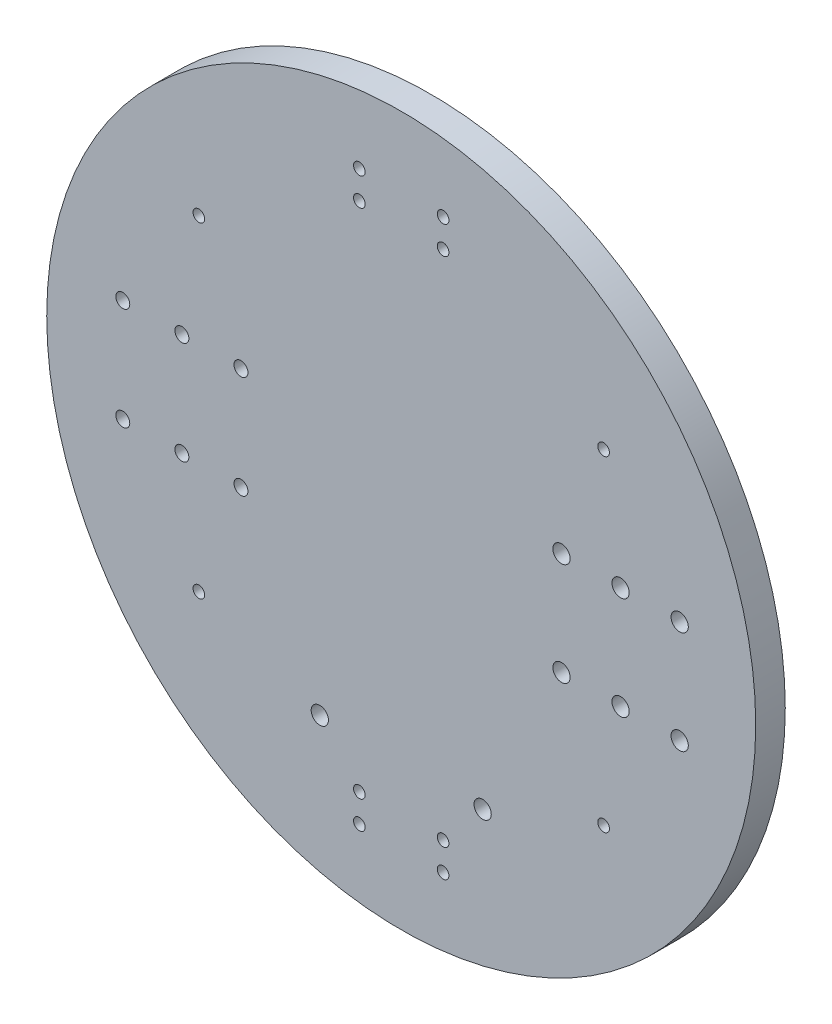
ISO-10303-21;
HEADER;
FILE_DESCRIPTION(('STEP AP214'),'2;1');
FILE_NAME('part.step','',(''),(''),'','','');
FILE_SCHEMA(('AUTOMOTIVE_DESIGN { 1 0 10303 214 1 1 1 1 }'));
ENDSEC;
DATA;
#1=APPLICATION_CONTEXT('core data for automotive mechanical design processes');
#2=APPLICATION_PROTOCOL_DEFINITION('international standard','automotive_design',2000,#1);
#3=PRODUCT_CONTEXT('',#1,'mechanical');
#4=PRODUCT('Part','Part','',(#3));
#5=PRODUCT_RELATED_PRODUCT_CATEGORY('part','',(#4));
#6=PRODUCT_DEFINITION_FORMATION('','',#4);
#7=PRODUCT_DEFINITION_CONTEXT('part definition',#1,'design');
#8=PRODUCT_DEFINITION('design','',#6,#7);
#9=PRODUCT_DEFINITION_SHAPE('','',#8);
#10=(LENGTH_UNIT() NAMED_UNIT(*) SI_UNIT(.MILLI.,.METRE.));
#11=(NAMED_UNIT(*) PLANE_ANGLE_UNIT() SI_UNIT($,.RADIAN.));
#12=(NAMED_UNIT(*) SI_UNIT($,.STERADIAN.) SOLID_ANGLE_UNIT());
#13=UNCERTAINTY_MEASURE_WITH_UNIT(LENGTH_MEASURE(1.E-05),#10,'distance_accuracy_value','');
#14=(GEOMETRIC_REPRESENTATION_CONTEXT(3) GLOBAL_UNCERTAINTY_ASSIGNED_CONTEXT((#13)) GLOBAL_UNIT_ASSIGNED_CONTEXT((#10,
#11,#12)) REPRESENTATION_CONTEXT('',''));
#15=CARTESIAN_POINT('',(0.,0.,0.));
#16=DIRECTION('',(0.,0.,1.));
#17=DIRECTION('',(1.,0.,0.));
#18=AXIS2_PLACEMENT_3D('',#15,#16,#17);
#19=CARTESIAN_POINT('',(0.,0.,6.35));
#20=DIRECTION('',(0.,0.,-1.));
#21=DIRECTION('',(-1.,0.,0.));
#22=AXIS2_PLACEMENT_3D('',#19,#20,#21);
#23=CYLINDRICAL_SURFACE('',#22,76.2);
#24=CARTESIAN_POINT('',(0.,0.,6.35));
#25=DIRECTION('',(0.,0.,1.));
#26=DIRECTION('',(1.,0.,0.));
#27=AXIS2_PLACEMENT_3D('',#24,#25,#26);
#28=CIRCLE('',#27,76.2);
#29=CARTESIAN_POINT('',(76.2,0.,6.35));
#30=VERTEX_POINT('',#29);
#31=EDGE_CURVE('E10',#30,#30,#28,.T.);
#32=ORIENTED_EDGE('',*,*,#31,.F.);
#33=EDGE_LOOP('',(#32));
#34=FACE_BOUND('',#33,.T.);
#35=CARTESIAN_POINT('',(0.,0.,0.));
#36=DIRECTION('',(0.,0.,1.));
#37=DIRECTION('',(1.,0.,0.));
#38=AXIS2_PLACEMENT_3D('',#35,#36,#37);
#39=CIRCLE('',#38,76.2);
#40=CARTESIAN_POINT('',(76.2,0.,0.));
#41=VERTEX_POINT('',#40);
#42=EDGE_CURVE('E46',#41,#41,#39,.T.);
#43=ORIENTED_EDGE('',*,*,#42,.T.);
#44=EDGE_LOOP('',(#43));
#45=FACE_BOUND('',#44,.T.);
#46=ADVANCED_FACE('F43',(#34,#45),#23,.T.);
#47=CARTESIAN_POINT('',(0.,0.,6.35));
#48=DIRECTION('',(0.,0.,1.));
#49=DIRECTION('',(1.,0.,0.));
#50=AXIS2_PLACEMENT_3D('',#47,#48,#49);
#51=PLANE('',#50);
#52=CARTESIAN_POINT('',(-34.45,11.05,6.35));
#53=DIRECTION('',(0.,0.,1.));
#54=DIRECTION('',(1.,0.,0.));
#55=AXIS2_PLACEMENT_3D('',#52,#53,#54);
#56=CIRCLE('',#55,1.5);
#57=CARTESIAN_POINT('',(-32.95,11.05,6.35));
#58=VERTEX_POINT('',#57);
#59=EDGE_CURVE('E150',#58,#58,#56,.T.);
#60=ORIENTED_EDGE('',*,*,#59,.F.);
#61=EDGE_LOOP('',(#60));
#62=FACE_BOUND('',#61,.T.);
#63=CARTESIAN_POINT('',(-9.00000000000001,55.,6.35));
#64=DIRECTION('',(0.,0.,1.));
#65=DIRECTION('',(1.,0.,0.));
#66=AXIS2_PLACEMENT_3D('',#63,#64,#65);
#67=CIRCLE('',#66,1.25);
#68=CARTESIAN_POINT('',(-7.75000000000001,55.,6.35));
#69=VERTEX_POINT('',#68);
#70=EDGE_CURVE('E188',#69,#69,#67,.T.);
#71=ORIENTED_EDGE('',*,*,#70,.F.);
#72=EDGE_LOOP('',(#71));
#73=FACE_BOUND('',#72,.T.);
#74=CARTESIAN_POINT('',(-9.00000000000001,61.,6.35));
#75=DIRECTION('',(0.,0.,1.));
#76=DIRECTION('',(1.,0.,0.));
#77=AXIS2_PLACEMENT_3D('',#74,#75,#76);
#78=CIRCLE('',#77,1.25);
#79=CARTESIAN_POINT('',(-7.75000000000001,61.,6.35));
#80=VERTEX_POINT('',#79);
#81=EDGE_CURVE('E192',#80,#80,#78,.T.);
#82=ORIENTED_EDGE('',*,*,#81,.F.);
#83=EDGE_LOOP('',(#82));
#84=FACE_BOUND('',#83,.T.);
#85=CARTESIAN_POINT('',(8.99999999999999,55.,6.35));
#86=DIRECTION('',(0.,0.,1.));
#87=DIRECTION('',(1.,0.,0.));
#88=AXIS2_PLACEMENT_3D('',#85,#86,#87);
#89=CIRCLE('',#88,1.25);
#90=CARTESIAN_POINT('',(10.25,55.,6.35));
#91=VERTEX_POINT('',#90);
#92=EDGE_CURVE('E196',#91,#91,#89,.T.);
#93=ORIENTED_EDGE('',*,*,#92,.F.);
#94=EDGE_LOOP('',(#93));
#95=FACE_BOUND('',#94,.T.);
#96=CARTESIAN_POINT('',(-47.15,11.05,6.35));
#97=DIRECTION('',(0.,0.,1.));
#98=DIRECTION('',(1.,0.,0.));
#99=AXIS2_PLACEMENT_3D('',#96,#97,#98);
#100=CIRCLE('',#99,1.5);
#101=CARTESIAN_POINT('',(-45.65,11.05,6.35));
#102=VERTEX_POINT('',#101);
#103=EDGE_CURVE('E200',#102,#102,#100,.T.);
#104=ORIENTED_EDGE('',*,*,#103,.F.);
#105=EDGE_LOOP('',(#104));
#106=FACE_BOUND('',#105,.T.);
#107=CARTESIAN_POINT('',(-59.85,11.05,6.35));
#108=DIRECTION('',(0.,0.,1.));
#109=DIRECTION('',(1.,0.,0.));
#110=AXIS2_PLACEMENT_3D('',#107,#108,#109);
#111=CIRCLE('',#110,1.5);
#112=CARTESIAN_POINT('',(-58.35,11.05,6.35));
#113=VERTEX_POINT('',#112);
#114=EDGE_CURVE('E204',#113,#113,#111,.T.);
#115=ORIENTED_EDGE('',*,*,#114,.F.);
#116=EDGE_LOOP('',(#115));
#117=FACE_BOUND('',#116,.T.);
#118=CARTESIAN_POINT('',(-59.85,-11.05,6.35));
#119=DIRECTION('',(0.,0.,1.));
#120=DIRECTION('',(1.,0.,0.));
#121=AXIS2_PLACEMENT_3D('',#118,#119,#120);
#122=CIRCLE('',#121,1.5);
#123=CARTESIAN_POINT('',(-58.35,-11.05,6.35));
#124=VERTEX_POINT('',#123);
#125=EDGE_CURVE('E208',#124,#124,#122,.T.);
#126=ORIENTED_EDGE('',*,*,#125,.F.);
#127=EDGE_LOOP('',(#126));
#128=FACE_BOUND('',#127,.T.);
#129=CARTESIAN_POINT('',(-47.15,-11.05,6.35));
#130=DIRECTION('',(0.,0.,1.));
#131=DIRECTION('',(1.,0.,0.));
#132=AXIS2_PLACEMENT_3D('',#129,#130,#131);
#133=CIRCLE('',#132,1.5);
#134=CARTESIAN_POINT('',(-45.65,-11.05,6.35));
#135=VERTEX_POINT('',#134);
#136=EDGE_CURVE('E212',#135,#135,#133,.T.);
#137=ORIENTED_EDGE('',*,*,#136,.F.);
#138=EDGE_LOOP('',(#137));
#139=FACE_BOUND('',#138,.T.);
#140=CARTESIAN_POINT('',(-34.45,-11.05,6.35));
#141=DIRECTION('',(0.,0.,1.));
#142=DIRECTION('',(1.,0.,0.));
#143=AXIS2_PLACEMENT_3D('',#140,#141,#142);
#144=CIRCLE('',#143,1.5);
#145=CARTESIAN_POINT('',(-32.95,-11.05,6.35));
#146=VERTEX_POINT('',#145);
#147=EDGE_CURVE('E216',#146,#146,#144,.T.);
#148=ORIENTED_EDGE('',*,*,#147,.F.);
#149=EDGE_LOOP('',(#148));
#150=FACE_BOUND('',#149,.T.);
#151=CARTESIAN_POINT('',(8.99999999999999,61.,6.35));
#152=DIRECTION('',(0.,0.,1.));
#153=DIRECTION('',(1.,0.,0.));
#154=AXIS2_PLACEMENT_3D('',#151,#152,#153);
#155=CIRCLE('',#154,1.25);
#156=CARTESIAN_POINT('',(10.25,61.,6.35));
#157=VERTEX_POINT('',#156);
#158=EDGE_CURVE('E220',#157,#157,#155,.T.);
#159=ORIENTED_EDGE('',*,*,#158,.F.);
#160=EDGE_LOOP('',(#159));
#161=FACE_BOUND('',#160,.T.);
#162=CARTESIAN_POINT('',(59.85,-11.05,6.35));
#163=DIRECTION('',(0.,0.,-1.));
#164=DIRECTION('',(-1.,0.,0.));
#165=AXIS2_PLACEMENT_3D('',#162,#163,#164);
#166=CIRCLE('',#165,1.855);
#167=CARTESIAN_POINT('',(57.995,-11.05,6.35));
#168=VERTEX_POINT('',#167);
#169=EDGE_CURVE('E145',#168,#168,#166,.T.);
#170=ORIENTED_EDGE('',*,*,#169,.T.);
#171=EDGE_LOOP('',(#170));
#172=FACE_BOUND('',#171,.T.);
#173=CARTESIAN_POINT('',(47.15,-11.05,6.35));
#174=DIRECTION('',(0.,0.,-1.));
#175=DIRECTION('',(-1.,0.,0.));
#176=AXIS2_PLACEMENT_3D('',#173,#174,#175);
#177=CIRCLE('',#176,1.855);
#178=CARTESIAN_POINT('',(45.295,-11.05,6.35));
#179=VERTEX_POINT('',#178);
#180=EDGE_CURVE('E154',#179,#179,#177,.T.);
#181=ORIENTED_EDGE('',*,*,#180,.T.);
#182=EDGE_LOOP('',(#181));
#183=FACE_BOUND('',#182,.T.);
#184=CARTESIAN_POINT('',(34.45,-11.05,6.35));
#185=DIRECTION('',(0.,0.,-1.));
#186=DIRECTION('',(-1.,0.,0.));
#187=AXIS2_PLACEMENT_3D('',#184,#185,#186);
#188=CIRCLE('',#187,1.855);
#189=CARTESIAN_POINT('',(32.595,-11.05,6.35));
#190=VERTEX_POINT('',#189);
#191=EDGE_CURVE('E162',#190,#190,#188,.T.);
#192=ORIENTED_EDGE('',*,*,#191,.T.);
#193=EDGE_LOOP('',(#192));
#194=FACE_BOUND('',#193,.T.);
#195=CARTESIAN_POINT('',(34.45,11.05,6.35));
#196=DIRECTION('',(0.,0.,-1.));
#197=DIRECTION('',(-1.,0.,0.));
#198=AXIS2_PLACEMENT_3D('',#195,#196,#197);
#199=CIRCLE('',#198,1.855);
#200=CARTESIAN_POINT('',(32.595,11.05,6.35));
#201=VERTEX_POINT('',#200);
#202=EDGE_CURVE('E170',#201,#201,#199,.T.);
#203=ORIENTED_EDGE('',*,*,#202,.T.);
#204=EDGE_LOOP('',(#203));
#205=FACE_BOUND('',#204,.T.);
#206=CARTESIAN_POINT('',(47.15,11.05,6.35));
#207=DIRECTION('',(0.,0.,-1.));
#208=DIRECTION('',(-1.,0.,0.));
#209=AXIS2_PLACEMENT_3D('',#206,#207,#208);
#210=CIRCLE('',#209,1.855);
#211=CARTESIAN_POINT('',(45.295,11.05,6.35));
#212=VERTEX_POINT('',#211);
#213=EDGE_CURVE('E178',#212,#212,#210,.T.);
#214=ORIENTED_EDGE('',*,*,#213,.T.);
#215=EDGE_LOOP('',(#214));
#216=FACE_BOUND('',#215,.T.);
#217=CARTESIAN_POINT('',(59.85,11.05,6.35));
#218=DIRECTION('',(0.,0.,-1.));
#219=DIRECTION('',(-1.,0.,0.));
#220=AXIS2_PLACEMENT_3D('',#217,#218,#219);
#221=CIRCLE('',#220,1.855);
#222=CARTESIAN_POINT('',(57.995,11.05,6.35));
#223=VERTEX_POINT('',#222);
#224=EDGE_CURVE('E133',#223,#223,#221,.T.);
#225=ORIENTED_EDGE('',*,*,#224,.T.);
#226=EDGE_LOOP('',(#225));
#227=FACE_BOUND('',#226,.T.);
#228=CARTESIAN_POINT('',(-17.5,-45.,6.35));
#229=DIRECTION('',(0.,0.,1.));
#230=DIRECTION('',(1.,0.,0.));
#231=AXIS2_PLACEMENT_3D('',#228,#229,#230);
#232=CIRCLE('',#231,1.855);
#233=CARTESIAN_POINT('',(-15.645,-45.,6.35));
#234=VERTEX_POINT('',#233);
#235=EDGE_CURVE('E86',#234,#234,#232,.T.);
#236=ORIENTED_EDGE('',*,*,#235,.F.);
#237=EDGE_LOOP('',(#236));
#238=FACE_BOUND('',#237,.T.);
#239=CARTESIAN_POINT('',(9.00000000000002,-61.,6.35));
#240=DIRECTION('',(0.,0.,1.));
#241=DIRECTION('',(1.,0.,0.));
#242=AXIS2_PLACEMENT_3D('',#239,#240,#241);
#243=CIRCLE('',#242,1.25);
#244=CARTESIAN_POINT('',(10.25,-61.,6.35));
#245=VERTEX_POINT('',#244);
#246=EDGE_CURVE('E101',#245,#245,#243,.T.);
#247=ORIENTED_EDGE('',*,*,#246,.F.);
#248=EDGE_LOOP('',(#247));
#249=FACE_BOUND('',#248,.T.);
#250=CARTESIAN_POINT('',(-8.99999999999998,-61.,6.35));
#251=DIRECTION('',(0.,0.,1.));
#252=DIRECTION('',(1.,0.,0.));
#253=AXIS2_PLACEMENT_3D('',#250,#251,#252);
#254=CIRCLE('',#253,1.25);
#255=CARTESIAN_POINT('',(-7.74999999999998,-61.,6.35));
#256=VERTEX_POINT('',#255);
#257=EDGE_CURVE('E102',#256,#256,#254,.T.);
#258=ORIENTED_EDGE('',*,*,#257,.F.);
#259=EDGE_LOOP('',(#258));
#260=FACE_BOUND('',#259,.T.);
#261=CARTESIAN_POINT('',(-8.99999999999998,-55.,6.35));
#262=DIRECTION('',(0.,0.,1.));
#263=DIRECTION('',(1.,0.,0.));
#264=AXIS2_PLACEMENT_3D('',#261,#262,#263);
#265=CIRCLE('',#264,1.25);
#266=CARTESIAN_POINT('',(-7.74999999999998,-55.,6.35));
#267=VERTEX_POINT('',#266);
#268=EDGE_CURVE('E117',#267,#267,#265,.T.);
#269=ORIENTED_EDGE('',*,*,#268,.F.);
#270=EDGE_LOOP('',(#269));
#271=FACE_BOUND('',#270,.T.);
#272=CARTESIAN_POINT('',(43.5,35.,6.35));
#273=DIRECTION('',(0.,0.,1.));
#274=DIRECTION('',(1.,0.,0.));
#275=AXIS2_PLACEMENT_3D('',#272,#273,#274);
#276=CIRCLE('',#275,1.25);
#277=CARTESIAN_POINT('',(44.75,35.,6.35));
#278=VERTEX_POINT('',#277);
#279=EDGE_CURVE('E61',#278,#278,#276,.T.);
#280=ORIENTED_EDGE('',*,*,#279,.F.);
#281=EDGE_LOOP('',(#280));
#282=FACE_BOUND('',#281,.T.);
#283=CARTESIAN_POINT('',(-43.5,-35.,6.35));
#284=DIRECTION('',(0.,0.,1.));
#285=DIRECTION('',(1.,0.,0.));
#286=AXIS2_PLACEMENT_3D('',#283,#284,#285);
#287=CIRCLE('',#286,1.25);
#288=CARTESIAN_POINT('',(-42.25,-35.,6.35));
#289=VERTEX_POINT('',#288);
#290=EDGE_CURVE('E69',#289,#289,#287,.T.);
#291=ORIENTED_EDGE('',*,*,#290,.F.);
#292=EDGE_LOOP('',(#291));
#293=FACE_BOUND('',#292,.T.);
#294=CARTESIAN_POINT('',(43.5,-35.,6.35));
#295=DIRECTION('',(0.,0.,1.));
#296=DIRECTION('',(1.,0.,0.));
#297=AXIS2_PLACEMENT_3D('',#294,#295,#296);
#298=CIRCLE('',#297,1.25);
#299=CARTESIAN_POINT('',(44.75,-35.,6.35));
#300=VERTEX_POINT('',#299);
#301=EDGE_CURVE('E70',#300,#300,#298,.T.);
#302=ORIENTED_EDGE('',*,*,#301,.F.);
#303=EDGE_LOOP('',(#302));
#304=FACE_BOUND('',#303,.T.);
#305=CARTESIAN_POINT('',(17.5,-45.,6.35));
#306=DIRECTION('',(0.,0.,1.));
#307=DIRECTION('',(1.,0.,0.));
#308=AXIS2_PLACEMENT_3D('',#305,#306,#307);
#309=CIRCLE('',#308,1.855);
#310=CARTESIAN_POINT('',(19.355,-45.,6.35));
#311=VERTEX_POINT('',#310);
#312=EDGE_CURVE('E85',#311,#311,#309,.T.);
#313=ORIENTED_EDGE('',*,*,#312,.F.);
#314=EDGE_LOOP('',(#313));
#315=FACE_BOUND('',#314,.T.);
#316=CARTESIAN_POINT('',(9.00000000000002,-55.,6.35));
#317=DIRECTION('',(0.,0.,1.));
#318=DIRECTION('',(1.,0.,0.));
#319=AXIS2_PLACEMENT_3D('',#316,#317,#318);
#320=CIRCLE('',#319,1.25);
#321=CARTESIAN_POINT('',(10.25,-55.,6.35));
#322=VERTEX_POINT('',#321);
#323=EDGE_CURVE('E118',#322,#322,#320,.T.);
#324=ORIENTED_EDGE('',*,*,#323,.F.);
#325=EDGE_LOOP('',(#324));
#326=FACE_BOUND('',#325,.T.);
#327=CARTESIAN_POINT('',(-43.5,35.,6.35));
#328=DIRECTION('',(0.,0.,1.));
#329=DIRECTION('',(1.,0.,0.));
#330=AXIS2_PLACEMENT_3D('',#327,#328,#329);
#331=CIRCLE('',#330,1.25);
#332=CARTESIAN_POINT('',(-42.25,35.,6.35));
#333=VERTEX_POINT('',#332);
#334=EDGE_CURVE('E57',#333,#333,#331,.T.);
#335=ORIENTED_EDGE('',*,*,#334,.F.);
#336=EDGE_LOOP('',(#335));
#337=FACE_BOUND('',#336,.T.);
#338=ORIENTED_EDGE('',*,*,#31,.T.);
#339=EDGE_LOOP('',(#338));
#340=FACE_BOUND('',#339,.T.);
#341=ADVANCED_FACE('F271',(#62,#73,#84,#95,#106,#117,#128,#139,#150,#161,#172,#183,#194,#205,
#216,#227,#238,#249,#260,#271,#282,#293,#304,#315,#326,#337,#340),#51,.T.);
#342=CARTESIAN_POINT('',(0.,0.,0.));
#343=DIRECTION('',(0.,0.,1.));
#344=DIRECTION('',(1.,0.,0.));
#345=AXIS2_PLACEMENT_3D('',#342,#343,#344);
#346=PLANE('',#345);
#347=CARTESIAN_POINT('',(-34.45,11.05,0.));
#348=DIRECTION('',(0.,0.,-1.));
#349=DIRECTION('',(-1.,0.,0.));
#350=AXIS2_PLACEMENT_3D('',#347,#348,#349);
#351=CIRCLE('',#350,1.5);
#352=CARTESIAN_POINT('',(-35.95,11.05,0.));
#353=VERTEX_POINT('',#352);
#354=EDGE_CURVE('E246',#353,#353,#351,.T.);
#355=ORIENTED_EDGE('',*,*,#354,.F.);
#356=EDGE_LOOP('',(#355));
#357=FACE_BOUND('',#356,.T.);
#358=CARTESIAN_POINT('',(-9.00000000000001,55.,0.));
#359=DIRECTION('',(0.,0.,-1.));
#360=DIRECTION('',(-1.,0.,0.));
#361=AXIS2_PLACEMENT_3D('',#358,#359,#360);
#362=CIRCLE('',#361,1.25);
#363=CARTESIAN_POINT('',(-10.25,55.,0.));
#364=VERTEX_POINT('',#363);
#365=EDGE_CURVE('E251',#364,#364,#362,.T.);
#366=ORIENTED_EDGE('',*,*,#365,.F.);
#367=EDGE_LOOP('',(#366));
#368=FACE_BOUND('',#367,.T.);
#369=CARTESIAN_POINT('',(-9.00000000000001,61.,0.));
#370=DIRECTION('',(0.,0.,-1.));
#371=DIRECTION('',(-1.,0.,0.));
#372=AXIS2_PLACEMENT_3D('',#369,#370,#371);
#373=CIRCLE('',#372,1.25);
#374=CARTESIAN_POINT('',(-10.25,61.,0.));
#375=VERTEX_POINT('',#374);
#376=EDGE_CURVE('E247',#375,#375,#373,.T.);
#377=ORIENTED_EDGE('',*,*,#376,.F.);
#378=EDGE_LOOP('',(#377));
#379=FACE_BOUND('',#378,.T.);
#380=CARTESIAN_POINT('',(8.99999999999999,55.,0.));
#381=DIRECTION('',(0.,0.,-1.));
#382=DIRECTION('',(-1.,0.,0.));
#383=AXIS2_PLACEMENT_3D('',#380,#381,#382);
#384=CIRCLE('',#383,1.25);
#385=CARTESIAN_POINT('',(7.74999999999999,55.,0.));
#386=VERTEX_POINT('',#385);
#387=EDGE_CURVE('E228',#386,#386,#384,.T.);
#388=ORIENTED_EDGE('',*,*,#387,.F.);
#389=EDGE_LOOP('',(#388));
#390=FACE_BOUND('',#389,.T.);
#391=CARTESIAN_POINT('',(-47.15,11.05,0.));
#392=DIRECTION('',(0.,0.,-1.));
#393=DIRECTION('',(-1.,0.,0.));
#394=AXIS2_PLACEMENT_3D('',#391,#392,#393);
#395=CIRCLE('',#394,1.5);
#396=CARTESIAN_POINT('',(-48.65,11.05,0.));
#397=VERTEX_POINT('',#396);
#398=EDGE_CURVE('E242',#397,#397,#395,.T.);
#399=ORIENTED_EDGE('',*,*,#398,.F.);
#400=EDGE_LOOP('',(#399));
#401=FACE_BOUND('',#400,.T.);
#402=CARTESIAN_POINT('',(-59.85,11.05,0.));
#403=DIRECTION('',(0.,0.,-1.));
#404=DIRECTION('',(-1.,0.,0.));
#405=AXIS2_PLACEMENT_3D('',#402,#403,#404);
#406=CIRCLE('',#405,1.5);
#407=CARTESIAN_POINT('',(-61.35,11.05,0.));
#408=VERTEX_POINT('',#407);
#409=EDGE_CURVE('E238',#408,#408,#406,.T.);
#410=ORIENTED_EDGE('',*,*,#409,.F.);
#411=EDGE_LOOP('',(#410));
#412=FACE_BOUND('',#411,.T.);
#413=CARTESIAN_POINT('',(-59.85,-11.05,0.));
#414=DIRECTION('',(0.,0.,-1.));
#415=DIRECTION('',(-1.,0.,0.));
#416=AXIS2_PLACEMENT_3D('',#413,#414,#415);
#417=CIRCLE('',#416,1.5);
#418=CARTESIAN_POINT('',(-61.35,-11.05,0.));
#419=VERTEX_POINT('',#418);
#420=EDGE_CURVE('E233',#419,#419,#417,.T.);
#421=ORIENTED_EDGE('',*,*,#420,.F.);
#422=EDGE_LOOP('',(#421));
#423=FACE_BOUND('',#422,.T.);
#424=CARTESIAN_POINT('',(-47.15,-11.05,0.));
#425=DIRECTION('',(0.,0.,-1.));
#426=DIRECTION('',(-1.,0.,0.));
#427=AXIS2_PLACEMENT_3D('',#424,#425,#426);
#428=CIRCLE('',#427,1.5);
#429=CARTESIAN_POINT('',(-48.65,-11.05,0.));
#430=VERTEX_POINT('',#429);
#431=EDGE_CURVE('E229',#430,#430,#428,.T.);
#432=ORIENTED_EDGE('',*,*,#431,.F.);
#433=EDGE_LOOP('',(#432));
#434=FACE_BOUND('',#433,.T.);
#435=CARTESIAN_POINT('',(-34.45,-11.05,0.));
#436=DIRECTION('',(0.,0.,-1.));
#437=DIRECTION('',(-1.,0.,0.));
#438=AXIS2_PLACEMENT_3D('',#435,#436,#437);
#439=CIRCLE('',#438,1.5);
#440=CARTESIAN_POINT('',(-35.95,-11.05,0.));
#441=VERTEX_POINT('',#440);
#442=EDGE_CURVE('E234',#441,#441,#439,.T.);
#443=ORIENTED_EDGE('',*,*,#442,.F.);
#444=EDGE_LOOP('',(#443));
#445=FACE_BOUND('',#444,.T.);
#446=CARTESIAN_POINT('',(8.99999999999999,61.,0.));
#447=DIRECTION('',(0.,0.,-1.));
#448=DIRECTION('',(-1.,0.,0.));
#449=AXIS2_PLACEMENT_3D('',#446,#447,#448);
#450=CIRCLE('',#449,1.25);
#451=CARTESIAN_POINT('',(7.74999999999999,61.,0.));
#452=VERTEX_POINT('',#451);
#453=EDGE_CURVE('E224',#452,#452,#450,.T.);
#454=ORIENTED_EDGE('',*,*,#453,.F.);
#455=EDGE_LOOP('',(#454));
#456=FACE_BOUND('',#455,.T.);
#457=CARTESIAN_POINT('',(59.85,-11.05,0.));
#458=DIRECTION('',(0.,0.,-1.));
#459=DIRECTION('',(-1.,0.,0.));
#460=AXIS2_PLACEMENT_3D('',#457,#458,#459);
#461=CIRCLE('',#460,1.855);
#462=CARTESIAN_POINT('',(57.995,-11.05,0.));
#463=VERTEX_POINT('',#462);
#464=EDGE_CURVE('E149',#463,#463,#461,.T.);
#465=ORIENTED_EDGE('',*,*,#464,.F.);
#466=EDGE_LOOP('',(#465));
#467=FACE_BOUND('',#466,.T.);
#468=CARTESIAN_POINT('',(47.15,-11.05,0.));
#469=DIRECTION('',(0.,0.,-1.));
#470=DIRECTION('',(-1.,0.,0.));
#471=AXIS2_PLACEMENT_3D('',#468,#469,#470);
#472=CIRCLE('',#471,1.855);
#473=CARTESIAN_POINT('',(45.295,-11.05,0.));
#474=VERTEX_POINT('',#473);
#475=EDGE_CURVE('E158',#474,#474,#472,.T.);
#476=ORIENTED_EDGE('',*,*,#475,.F.);
#477=EDGE_LOOP('',(#476));
#478=FACE_BOUND('',#477,.T.);
#479=CARTESIAN_POINT('',(34.45,-11.05,0.));
#480=DIRECTION('',(0.,0.,-1.));
#481=DIRECTION('',(-1.,0.,0.));
#482=AXIS2_PLACEMENT_3D('',#479,#480,#481);
#483=CIRCLE('',#482,1.855);
#484=CARTESIAN_POINT('',(32.595,-11.05,0.));
#485=VERTEX_POINT('',#484);
#486=EDGE_CURVE('E166',#485,#485,#483,.T.);
#487=ORIENTED_EDGE('',*,*,#486,.F.);
#488=EDGE_LOOP('',(#487));
#489=FACE_BOUND('',#488,.T.);
#490=CARTESIAN_POINT('',(34.45,11.05,0.));
#491=DIRECTION('',(0.,0.,-1.));
#492=DIRECTION('',(-1.,0.,0.));
#493=AXIS2_PLACEMENT_3D('',#490,#491,#492);
#494=CIRCLE('',#493,1.855);
#495=CARTESIAN_POINT('',(32.595,11.05,0.));
#496=VERTEX_POINT('',#495);
#497=EDGE_CURVE('E174',#496,#496,#494,.T.);
#498=ORIENTED_EDGE('',*,*,#497,.F.);
#499=EDGE_LOOP('',(#498));
#500=FACE_BOUND('',#499,.T.);
#501=CARTESIAN_POINT('',(47.15,11.05,0.));
#502=DIRECTION('',(0.,0.,-1.));
#503=DIRECTION('',(-1.,0.,0.));
#504=AXIS2_PLACEMENT_3D('',#501,#502,#503);
#505=CIRCLE('',#504,1.855);
#506=CARTESIAN_POINT('',(45.295,11.05,0.));
#507=VERTEX_POINT('',#506);
#508=EDGE_CURVE('E141',#507,#507,#505,.T.);
#509=ORIENTED_EDGE('',*,*,#508,.F.);
#510=EDGE_LOOP('',(#509));
#511=FACE_BOUND('',#510,.T.);
#512=CARTESIAN_POINT('',(59.85,11.05,0.));
#513=DIRECTION('',(0.,0.,-1.));
#514=DIRECTION('',(-1.,0.,0.));
#515=AXIS2_PLACEMENT_3D('',#512,#513,#514);
#516=CIRCLE('',#515,1.855);
#517=CARTESIAN_POINT('',(57.995,11.05,0.));
#518=VERTEX_POINT('',#517);
#519=EDGE_CURVE('E137',#518,#518,#516,.T.);
#520=ORIENTED_EDGE('',*,*,#519,.F.);
#521=EDGE_LOOP('',(#520));
#522=FACE_BOUND('',#521,.T.);
#523=CARTESIAN_POINT('',(-17.5,-45.,0.));
#524=DIRECTION('',(0.,0.,1.));
#525=DIRECTION('',(1.,0.,0.));
#526=AXIS2_PLACEMENT_3D('',#523,#524,#525);
#527=CIRCLE('',#526,1.855);
#528=CARTESIAN_POINT('',(-15.645,-45.,0.));
#529=VERTEX_POINT('',#528);
#530=EDGE_CURVE('E106',#529,#529,#527,.T.);
#531=ORIENTED_EDGE('',*,*,#530,.T.);
#532=EDGE_LOOP('',(#531));
#533=FACE_BOUND('',#532,.T.);
#534=CARTESIAN_POINT('',(9.00000000000002,-61.,0.));
#535=DIRECTION('',(0.,0.,1.));
#536=DIRECTION('',(1.,0.,0.));
#537=AXIS2_PLACEMENT_3D('',#534,#535,#536);
#538=CIRCLE('',#537,1.25);
#539=CARTESIAN_POINT('',(10.25,-61.,0.));
#540=VERTEX_POINT('',#539);
#541=EDGE_CURVE('E97',#540,#540,#538,.T.);
#542=ORIENTED_EDGE('',*,*,#541,.T.);
#543=EDGE_LOOP('',(#542));
#544=FACE_BOUND('',#543,.T.);
#545=CARTESIAN_POINT('',(-8.99999999999998,-61.,0.));
#546=DIRECTION('',(0.,0.,1.));
#547=DIRECTION('',(1.,0.,0.));
#548=AXIS2_PLACEMENT_3D('',#545,#546,#547);
#549=CIRCLE('',#548,1.25);
#550=CARTESIAN_POINT('',(-7.74999999999998,-61.,0.));
#551=VERTEX_POINT('',#550);
#552=EDGE_CURVE('E122',#551,#551,#549,.T.);
#553=ORIENTED_EDGE('',*,*,#552,.T.);
#554=EDGE_LOOP('',(#553));
#555=FACE_BOUND('',#554,.T.);
#556=CARTESIAN_POINT('',(-8.99999999999998,-55.,0.));
#557=DIRECTION('',(0.,0.,1.));
#558=DIRECTION('',(1.,0.,0.));
#559=AXIS2_PLACEMENT_3D('',#556,#557,#558);
#560=CIRCLE('',#559,1.25);
#561=CARTESIAN_POINT('',(-7.74999999999998,-55.,0.));
#562=VERTEX_POINT('',#561);
#563=EDGE_CURVE('E113',#562,#562,#560,.T.);
#564=ORIENTED_EDGE('',*,*,#563,.T.);
#565=EDGE_LOOP('',(#564));
#566=FACE_BOUND('',#565,.T.);
#567=CARTESIAN_POINT('',(43.5,35.,0.));
#568=DIRECTION('',(0.,0.,1.));
#569=DIRECTION('',(1.,0.,0.));
#570=AXIS2_PLACEMENT_3D('',#567,#568,#569);
#571=CIRCLE('',#570,1.25);
#572=CARTESIAN_POINT('',(44.75,35.,0.));
#573=VERTEX_POINT('',#572);
#574=EDGE_CURVE('E74',#573,#573,#571,.T.);
#575=ORIENTED_EDGE('',*,*,#574,.T.);
#576=EDGE_LOOP('',(#575));
#577=FACE_BOUND('',#576,.T.);
#578=CARTESIAN_POINT('',(-43.5,-35.,0.));
#579=DIRECTION('',(0.,0.,1.));
#580=DIRECTION('',(1.,0.,0.));
#581=AXIS2_PLACEMENT_3D('',#578,#579,#580);
#582=CIRCLE('',#581,1.25);
#583=CARTESIAN_POINT('',(-42.25,-35.,0.));
#584=VERTEX_POINT('',#583);
#585=EDGE_CURVE('E65',#584,#584,#582,.T.);
#586=ORIENTED_EDGE('',*,*,#585,.T.);
#587=EDGE_LOOP('',(#586));
#588=FACE_BOUND('',#587,.T.);
#589=CARTESIAN_POINT('',(43.5,-35.,0.));
#590=DIRECTION('',(0.,0.,1.));
#591=DIRECTION('',(1.,0.,0.));
#592=AXIS2_PLACEMENT_3D('',#589,#590,#591);
#593=CIRCLE('',#592,1.25);
#594=CARTESIAN_POINT('',(44.75,-35.,0.));
#595=VERTEX_POINT('',#594);
#596=EDGE_CURVE('E90',#595,#595,#593,.T.);
#597=ORIENTED_EDGE('',*,*,#596,.T.);
#598=EDGE_LOOP('',(#597));
#599=FACE_BOUND('',#598,.T.);
#600=CARTESIAN_POINT('',(17.5,-45.,0.));
#601=DIRECTION('',(0.,0.,1.));
#602=DIRECTION('',(1.,0.,0.));
#603=AXIS2_PLACEMENT_3D('',#600,#601,#602);
#604=CIRCLE('',#603,1.855);
#605=CARTESIAN_POINT('',(19.355,-45.,0.));
#606=VERTEX_POINT('',#605);
#607=EDGE_CURVE('E81',#606,#606,#604,.T.);
#608=ORIENTED_EDGE('',*,*,#607,.T.);
#609=EDGE_LOOP('',(#608));
#610=FACE_BOUND('',#609,.T.);
#611=CARTESIAN_POINT('',(9.00000000000002,-55.,0.));
#612=DIRECTION('',(0.,0.,1.));
#613=DIRECTION('',(1.,0.,0.));
#614=AXIS2_PLACEMENT_3D('',#611,#612,#613);
#615=CIRCLE('',#614,1.25);
#616=CARTESIAN_POINT('',(10.25,-55.,0.));
#617=VERTEX_POINT('',#616);
#618=EDGE_CURVE('E129',#617,#617,#615,.T.);
#619=ORIENTED_EDGE('',*,*,#618,.T.);
#620=EDGE_LOOP('',(#619));
#621=FACE_BOUND('',#620,.T.);
#622=CARTESIAN_POINT('',(-43.5,35.,0.));
#623=DIRECTION('',(0.,0.,1.));
#624=DIRECTION('',(1.,0.,0.));
#625=AXIS2_PLACEMENT_3D('',#622,#623,#624);
#626=CIRCLE('',#625,1.25);
#627=CARTESIAN_POINT('',(-42.25,35.,0.));
#628=VERTEX_POINT('',#627);
#629=EDGE_CURVE('E55',#628,#628,#626,.T.);
#630=ORIENTED_EDGE('',*,*,#629,.T.);
#631=EDGE_LOOP('',(#630));
#632=FACE_BOUND('',#631,.T.);
#633=ORIENTED_EDGE('',*,*,#42,.F.);
#634=EDGE_LOOP('',(#633));
#635=FACE_BOUND('',#634,.T.);
#636=ADVANCED_FACE('F267',(#357,#368,#379,#390,#401,#412,#423,#434,#445,#456,#467,#478,#489,
#500,#511,#522,#533,#544,#555,#566,#577,#588,#599,#610,#621,#632,#635),#346,.F.);
#637=CARTESIAN_POINT('',(-43.5,35.,0.));
#638=DIRECTION('',(0.,0.,1.));
#639=DIRECTION('',(1.,0.,0.));
#640=AXIS2_PLACEMENT_3D('',#637,#638,#639);
#641=CYLINDRICAL_SURFACE('',#640,1.25);
#642=ORIENTED_EDGE('',*,*,#629,.F.);
#643=EDGE_LOOP('',(#642));
#644=FACE_BOUND('',#643,.T.);
#645=ORIENTED_EDGE('',*,*,#334,.T.);
#646=EDGE_LOOP('',(#645));
#647=FACE_BOUND('',#646,.T.);
#648=ADVANCED_FACE('F270',(#644,#647),#641,.F.);
#649=CARTESIAN_POINT('',(9.00000000000002,-55.,0.));
#650=DIRECTION('',(0.,0.,1.));
#651=DIRECTION('',(1.,0.,0.));
#652=AXIS2_PLACEMENT_3D('',#649,#650,#651);
#653=CYLINDRICAL_SURFACE('',#652,1.25);
#654=ORIENTED_EDGE('',*,*,#618,.F.);
#655=EDGE_LOOP('',(#654));
#656=FACE_BOUND('',#655,.T.);
#657=ORIENTED_EDGE('',*,*,#323,.T.);
#658=EDGE_LOOP('',(#657));
#659=FACE_BOUND('',#658,.T.);
#660=ADVANCED_FACE('F324',(#656,#659),#653,.F.);
#661=CARTESIAN_POINT('',(17.5,-45.,0.));
#662=DIRECTION('',(0.,0.,1.));
#663=DIRECTION('',(1.,0.,0.));
#664=AXIS2_PLACEMENT_3D('',#661,#662,#663);
#665=CYLINDRICAL_SURFACE('',#664,1.855);
#666=ORIENTED_EDGE('',*,*,#607,.F.);
#667=EDGE_LOOP('',(#666));
#668=FACE_BOUND('',#667,.T.);
#669=ORIENTED_EDGE('',*,*,#312,.T.);
#670=EDGE_LOOP('',(#669));
#671=FACE_BOUND('',#670,.T.);
#672=ADVANCED_FACE('F336',(#668,#671),#665,.F.);
#673=CARTESIAN_POINT('',(43.5,-35.,0.));
#674=DIRECTION('',(0.,0.,1.));
#675=DIRECTION('',(1.,0.,0.));
#676=AXIS2_PLACEMENT_3D('',#673,#674,#675);
#677=CYLINDRICAL_SURFACE('',#676,1.25);
#678=ORIENTED_EDGE('',*,*,#596,.F.);
#679=EDGE_LOOP('',(#678));
#680=FACE_BOUND('',#679,.T.);
#681=ORIENTED_EDGE('',*,*,#301,.T.);
#682=EDGE_LOOP('',(#681));
#683=FACE_BOUND('',#682,.T.);
#684=ADVANCED_FACE('F330',(#680,#683),#677,.F.);
#685=CARTESIAN_POINT('',(-43.5,-35.,0.));
#686=DIRECTION('',(0.,0.,1.));
#687=DIRECTION('',(1.,0.,0.));
#688=AXIS2_PLACEMENT_3D('',#685,#686,#687);
#689=CYLINDRICAL_SURFACE('',#688,1.25);
#690=ORIENTED_EDGE('',*,*,#585,.F.);
#691=EDGE_LOOP('',(#690));
#692=FACE_BOUND('',#691,.T.);
#693=ORIENTED_EDGE('',*,*,#290,.T.);
#694=EDGE_LOOP('',(#693));
#695=FACE_BOUND('',#694,.T.);
#696=ADVANCED_FACE('F326',(#692,#695),#689,.F.);
#697=CARTESIAN_POINT('',(43.5,35.,0.));
#698=DIRECTION('',(0.,0.,1.));
#699=DIRECTION('',(1.,0.,0.));
#700=AXIS2_PLACEMENT_3D('',#697,#698,#699);
#701=CYLINDRICAL_SURFACE('',#700,1.25);
#702=ORIENTED_EDGE('',*,*,#574,.F.);
#703=EDGE_LOOP('',(#702));
#704=FACE_BOUND('',#703,.T.);
#705=ORIENTED_EDGE('',*,*,#279,.T.);
#706=EDGE_LOOP('',(#705));
#707=FACE_BOUND('',#706,.T.);
#708=ADVANCED_FACE('F329',(#704,#707),#701,.F.);
#709=CARTESIAN_POINT('',(-8.99999999999998,-55.,0.));
#710=DIRECTION('',(0.,0.,1.));
#711=DIRECTION('',(1.,0.,0.));
#712=AXIS2_PLACEMENT_3D('',#709,#710,#711);
#713=CYLINDRICAL_SURFACE('',#712,1.25);
#714=ORIENTED_EDGE('',*,*,#563,.F.);
#715=EDGE_LOOP('',(#714));
#716=FACE_BOUND('',#715,.T.);
#717=ORIENTED_EDGE('',*,*,#268,.T.);
#718=EDGE_LOOP('',(#717));
#719=FACE_BOUND('',#718,.T.);
#720=ADVANCED_FACE('F334',(#716,#719),#713,.F.);
#721=CARTESIAN_POINT('',(-8.99999999999998,-61.,0.));
#722=DIRECTION('',(0.,0.,1.));
#723=DIRECTION('',(1.,0.,0.));
#724=AXIS2_PLACEMENT_3D('',#721,#722,#723);
#725=CYLINDRICAL_SURFACE('',#724,1.25);
#726=ORIENTED_EDGE('',*,*,#552,.F.);
#727=EDGE_LOOP('',(#726));
#728=FACE_BOUND('',#727,.T.);
#729=ORIENTED_EDGE('',*,*,#257,.T.);
#730=EDGE_LOOP('',(#729));
#731=FACE_BOUND('',#730,.T.);
#732=ADVANCED_FACE('F347',(#728,#731),#725,.F.);
#733=CARTESIAN_POINT('',(9.00000000000002,-61.,0.));
#734=DIRECTION('',(0.,0.,1.));
#735=DIRECTION('',(1.,0.,0.));
#736=AXIS2_PLACEMENT_3D('',#733,#734,#735);
#737=CYLINDRICAL_SURFACE('',#736,1.25);
#738=ORIENTED_EDGE('',*,*,#541,.F.);
#739=EDGE_LOOP('',(#738));
#740=FACE_BOUND('',#739,.T.);
#741=ORIENTED_EDGE('',*,*,#246,.T.);
#742=EDGE_LOOP('',(#741));
#743=FACE_BOUND('',#742,.T.);
#744=ADVANCED_FACE('F343',(#740,#743),#737,.F.);
#745=CARTESIAN_POINT('',(-17.5,-45.,0.));
#746=DIRECTION('',(0.,0.,1.));
#747=DIRECTION('',(1.,0.,0.));
#748=AXIS2_PLACEMENT_3D('',#745,#746,#747);
#749=CYLINDRICAL_SURFACE('',#748,1.855);
#750=ORIENTED_EDGE('',*,*,#530,.F.);
#751=EDGE_LOOP('',(#750));
#752=FACE_BOUND('',#751,.T.);
#753=ORIENTED_EDGE('',*,*,#235,.T.);
#754=EDGE_LOOP('',(#753));
#755=FACE_BOUND('',#754,.T.);
#756=ADVANCED_FACE('F346',(#752,#755),#749,.F.);
#757=CARTESIAN_POINT('',(59.85,11.05,6.35));
#758=DIRECTION('',(0.,0.,-1.));
#759=DIRECTION('',(-1.,0.,0.));
#760=AXIS2_PLACEMENT_3D('',#757,#758,#759);
#761=CYLINDRICAL_SURFACE('',#760,1.855);
#762=ORIENTED_EDGE('',*,*,#224,.F.);
#763=EDGE_LOOP('',(#762));
#764=FACE_BOUND('',#763,.T.);
#765=ORIENTED_EDGE('',*,*,#519,.T.);
#766=EDGE_LOOP('',(#765));
#767=FACE_BOUND('',#766,.T.);
#768=ADVANCED_FACE('F351',(#764,#767),#761,.F.);
#769=CARTESIAN_POINT('',(47.15,11.05,6.35));
#770=DIRECTION('',(0.,0.,-1.));
#771=DIRECTION('',(-1.,0.,0.));
#772=AXIS2_PLACEMENT_3D('',#769,#770,#771);
#773=CYLINDRICAL_SURFACE('',#772,1.855);
#774=ORIENTED_EDGE('',*,*,#213,.F.);
#775=EDGE_LOOP('',(#774));
#776=FACE_BOUND('',#775,.T.);
#777=ORIENTED_EDGE('',*,*,#508,.T.);
#778=EDGE_LOOP('',(#777));
#779=FACE_BOUND('',#778,.T.);
#780=ADVANCED_FACE('F364',(#776,#779),#773,.F.);
#781=CARTESIAN_POINT('',(34.45,11.05,6.35));
#782=DIRECTION('',(0.,0.,-1.));
#783=DIRECTION('',(-1.,0.,0.));
#784=AXIS2_PLACEMENT_3D('',#781,#782,#783);
#785=CYLINDRICAL_SURFACE('',#784,1.855);
#786=ORIENTED_EDGE('',*,*,#202,.F.);
#787=EDGE_LOOP('',(#786));
#788=FACE_BOUND('',#787,.T.);
#789=ORIENTED_EDGE('',*,*,#497,.T.);
#790=EDGE_LOOP('',(#789));
#791=FACE_BOUND('',#790,.T.);
#792=ADVANCED_FACE('F377',(#788,#791),#785,.F.);
#793=CARTESIAN_POINT('',(34.45,-11.05,6.35));
#794=DIRECTION('',(0.,0.,-1.));
#795=DIRECTION('',(-1.,0.,0.));
#796=AXIS2_PLACEMENT_3D('',#793,#794,#795);
#797=CYLINDRICAL_SURFACE('',#796,1.855);
#798=ORIENTED_EDGE('',*,*,#191,.F.);
#799=EDGE_LOOP('',(#798));
#800=FACE_BOUND('',#799,.T.);
#801=ORIENTED_EDGE('',*,*,#486,.T.);
#802=EDGE_LOOP('',(#801));
#803=FACE_BOUND('',#802,.T.);
#804=ADVANCED_FACE('F373',(#800,#803),#797,.F.);
#805=CARTESIAN_POINT('',(47.15,-11.05,6.35));
#806=DIRECTION('',(0.,0.,-1.));
#807=DIRECTION('',(-1.,0.,0.));
#808=AXIS2_PLACEMENT_3D('',#805,#806,#807);
#809=CYLINDRICAL_SURFACE('',#808,1.855);
#810=ORIENTED_EDGE('',*,*,#180,.F.);
#811=EDGE_LOOP('',(#810));
#812=FACE_BOUND('',#811,.T.);
#813=ORIENTED_EDGE('',*,*,#475,.T.);
#814=EDGE_LOOP('',(#813));
#815=FACE_BOUND('',#814,.T.);
#816=ADVANCED_FACE('F369',(#812,#815),#809,.F.);
#817=CARTESIAN_POINT('',(59.85,-11.05,6.35));
#818=DIRECTION('',(0.,0.,-1.));
#819=DIRECTION('',(-1.,0.,0.));
#820=AXIS2_PLACEMENT_3D('',#817,#818,#819);
#821=CYLINDRICAL_SURFACE('',#820,1.855);
#822=ORIENTED_EDGE('',*,*,#169,.F.);
#823=EDGE_LOOP('',(#822));
#824=FACE_BOUND('',#823,.T.);
#825=ORIENTED_EDGE('',*,*,#464,.T.);
#826=EDGE_LOOP('',(#825));
#827=FACE_BOUND('',#826,.T.);
#828=ADVANCED_FACE('F366',(#824,#827),#821,.F.);
#829=CARTESIAN_POINT('',(8.99999999999999,61.,10.));
#830=DIRECTION('',(0.,0.,-1.));
#831=DIRECTION('',(-1.,0.,0.));
#832=AXIS2_PLACEMENT_3D('',#829,#830,#831);
#833=CYLINDRICAL_SURFACE('',#832,1.25);
#834=ORIENTED_EDGE('',*,*,#158,.T.);
#835=EDGE_LOOP('',(#834));
#836=FACE_BOUND('',#835,.T.);
#837=ORIENTED_EDGE('',*,*,#453,.T.);
#838=EDGE_LOOP('',(#837));
#839=FACE_BOUND('',#838,.T.);
#840=ADVANCED_FACE('F368',(#836,#839),#833,.F.);
#841=CARTESIAN_POINT('',(-34.45,-11.05,10.));
#842=DIRECTION('',(0.,0.,-1.));
#843=DIRECTION('',(-1.,0.,0.));
#844=AXIS2_PLACEMENT_3D('',#841,#842,#843);
#845=CYLINDRICAL_SURFACE('',#844,1.5);
#846=ORIENTED_EDGE('',*,*,#147,.T.);
#847=EDGE_LOOP('',(#846));
#848=FACE_BOUND('',#847,.T.);
#849=ORIENTED_EDGE('',*,*,#442,.T.);
#850=EDGE_LOOP('',(#849));
#851=FACE_BOUND('',#850,.T.);
#852=ADVANCED_FACE('F265',(#848,#851),#845,.F.);
#853=CARTESIAN_POINT('',(-47.15,-11.05,10.));
#854=DIRECTION('',(0.,0.,-1.));
#855=DIRECTION('',(-1.,0.,0.));
#856=AXIS2_PLACEMENT_3D('',#853,#854,#855);
#857=CYLINDRICAL_SURFACE('',#856,1.5);
#858=ORIENTED_EDGE('',*,*,#136,.T.);
#859=EDGE_LOOP('',(#858));
#860=FACE_BOUND('',#859,.T.);
#861=ORIENTED_EDGE('',*,*,#431,.T.);
#862=EDGE_LOOP('',(#861));
#863=FACE_BOUND('',#862,.T.);
#864=ADVANCED_FACE('F388',(#860,#863),#857,.F.);
#865=CARTESIAN_POINT('',(-59.85,-11.05,10.));
#866=DIRECTION('',(0.,0.,-1.));
#867=DIRECTION('',(-1.,0.,0.));
#868=AXIS2_PLACEMENT_3D('',#865,#866,#867);
#869=CYLINDRICAL_SURFACE('',#868,1.5);
#870=ORIENTED_EDGE('',*,*,#125,.T.);
#871=EDGE_LOOP('',(#870));
#872=FACE_BOUND('',#871,.T.);
#873=ORIENTED_EDGE('',*,*,#420,.T.);
#874=EDGE_LOOP('',(#873));
#875=FACE_BOUND('',#874,.T.);
#876=ADVANCED_FACE('F391',(#872,#875),#869,.F.);
#877=CARTESIAN_POINT('',(-59.85,11.05,10.));
#878=DIRECTION('',(0.,0.,-1.));
#879=DIRECTION('',(-1.,0.,0.));
#880=AXIS2_PLACEMENT_3D('',#877,#878,#879);
#881=CYLINDRICAL_SURFACE('',#880,1.5);
#882=ORIENTED_EDGE('',*,*,#114,.T.);
#883=EDGE_LOOP('',(#882));
#884=FACE_BOUND('',#883,.T.);
#885=ORIENTED_EDGE('',*,*,#409,.T.);
#886=EDGE_LOOP('',(#885));
#887=FACE_BOUND('',#886,.T.);
#888=ADVANCED_FACE('F395',(#884,#887),#881,.F.);
#889=CARTESIAN_POINT('',(-47.15,11.05,10.));
#890=DIRECTION('',(0.,0.,-1.));
#891=DIRECTION('',(-1.,0.,0.));
#892=AXIS2_PLACEMENT_3D('',#889,#890,#891);
#893=CYLINDRICAL_SURFACE('',#892,1.5);
#894=ORIENTED_EDGE('',*,*,#103,.T.);
#895=EDGE_LOOP('',(#894));
#896=FACE_BOUND('',#895,.T.);
#897=ORIENTED_EDGE('',*,*,#398,.T.);
#898=EDGE_LOOP('',(#897));
#899=FACE_BOUND('',#898,.T.);
#900=ADVANCED_FACE('F399',(#896,#899),#893,.F.);
#901=CARTESIAN_POINT('',(8.99999999999999,55.,10.));
#902=DIRECTION('',(0.,0.,-1.));
#903=DIRECTION('',(-1.,0.,0.));
#904=AXIS2_PLACEMENT_3D('',#901,#902,#903);
#905=CYLINDRICAL_SURFACE('',#904,1.25);
#906=ORIENTED_EDGE('',*,*,#92,.T.);
#907=EDGE_LOOP('',(#906));
#908=FACE_BOUND('',#907,.T.);
#909=ORIENTED_EDGE('',*,*,#387,.T.);
#910=EDGE_LOOP('',(#909));
#911=FACE_BOUND('',#910,.T.);
#912=ADVANCED_FACE('F403',(#908,#911),#905,.F.);
#913=CARTESIAN_POINT('',(-9.00000000000001,61.,10.));
#914=DIRECTION('',(0.,0.,-1.));
#915=DIRECTION('',(-1.,0.,0.));
#916=AXIS2_PLACEMENT_3D('',#913,#914,#915);
#917=CYLINDRICAL_SURFACE('',#916,1.25);
#918=ORIENTED_EDGE('',*,*,#81,.T.);
#919=EDGE_LOOP('',(#918));
#920=FACE_BOUND('',#919,.T.);
#921=ORIENTED_EDGE('',*,*,#376,.T.);
#922=EDGE_LOOP('',(#921));
#923=FACE_BOUND('',#922,.T.);
#924=ADVANCED_FACE('F405',(#920,#923),#917,.F.);
#925=CARTESIAN_POINT('',(-9.00000000000001,55.,10.));
#926=DIRECTION('',(0.,0.,-1.));
#927=DIRECTION('',(-1.,0.,0.));
#928=AXIS2_PLACEMENT_3D('',#925,#926,#927);
#929=CYLINDRICAL_SURFACE('',#928,1.25);
#930=ORIENTED_EDGE('',*,*,#70,.T.);
#931=EDGE_LOOP('',(#930));
#932=FACE_BOUND('',#931,.T.);
#933=ORIENTED_EDGE('',*,*,#365,.T.);
#934=EDGE_LOOP('',(#933));
#935=FACE_BOUND('',#934,.T.);
#936=ADVANCED_FACE('F408',(#932,#935),#929,.F.);
#937=CARTESIAN_POINT('',(-34.45,11.05,10.));
#938=DIRECTION('',(0.,0.,-1.));
#939=DIRECTION('',(-1.,0.,0.));
#940=AXIS2_PLACEMENT_3D('',#937,#938,#939);
#941=CYLINDRICAL_SURFACE('',#940,1.5);
#942=ORIENTED_EDGE('',*,*,#59,.T.);
#943=EDGE_LOOP('',(#942));
#944=FACE_BOUND('',#943,.T.);
#945=ORIENTED_EDGE('',*,*,#354,.T.);
#946=EDGE_LOOP('',(#945));
#947=FACE_BOUND('',#946,.T.);
#948=ADVANCED_FACE('F413',(#944,#947),#941,.F.);
#949=CLOSED_SHELL('',(#46,#341,#636,#648,#660,#672,#684,#696,#708,#720,#732,#744,#756,#768,#780,
#792,#804,#816,#828,#840,#852,#864,#876,#888,#900,#912,#924,#936,#948));
#950=MANIFOLD_SOLID_BREP('B2',#949);
#951=ADVANCED_BREP_SHAPE_REPRESENTATION('',(#18,#950),#14);
#952=SHAPE_DEFINITION_REPRESENTATION(#9,#951);
ENDSEC;
END-ISO-10303-21;
